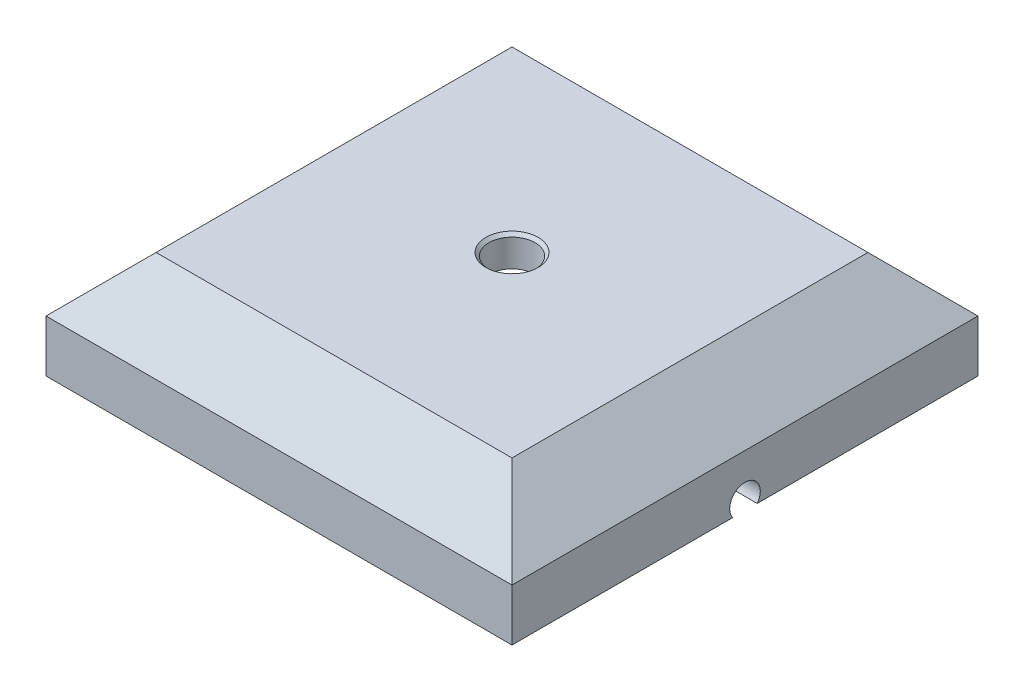
ISO-10303-21;
HEADER;
FILE_DESCRIPTION(('STEP AP214'),'2;1');
FILE_NAME('part.step','',(''),(''),'','','');
FILE_SCHEMA(('AUTOMOTIVE_DESIGN { 1 0 10303 214 1 1 1 1 }'));
ENDSEC;
DATA;
#1=APPLICATION_CONTEXT('core data for automotive mechanical design processes');
#2=APPLICATION_PROTOCOL_DEFINITION('international standard','automotive_design',2000,#1);
#3=PRODUCT_CONTEXT('',#1,'mechanical');
#4=PRODUCT('Part','Part','',(#3));
#5=PRODUCT_RELATED_PRODUCT_CATEGORY('part','',(#4));
#6=PRODUCT_DEFINITION_FORMATION('','',#4);
#7=PRODUCT_DEFINITION_CONTEXT('part definition',#1,'design');
#8=PRODUCT_DEFINITION('design','',#6,#7);
#9=PRODUCT_DEFINITION_SHAPE('','',#8);
#10=(LENGTH_UNIT() NAMED_UNIT(*) SI_UNIT(.MILLI.,.METRE.));
#11=(NAMED_UNIT(*) PLANE_ANGLE_UNIT() SI_UNIT($,.RADIAN.));
#12=(NAMED_UNIT(*) SI_UNIT($,.STERADIAN.) SOLID_ANGLE_UNIT());
#13=UNCERTAINTY_MEASURE_WITH_UNIT(LENGTH_MEASURE(1.E-05),#10,'distance_accuracy_value','');
#14=(GEOMETRIC_REPRESENTATION_CONTEXT(3) GLOBAL_UNCERTAINTY_ASSIGNED_CONTEXT((#13)) GLOBAL_UNIT_ASSIGNED_CONTEXT((#10,
#11,#12)) REPRESENTATION_CONTEXT('',''));
#15=CARTESIAN_POINT('',(0.,0.,0.));
#16=DIRECTION('',(0.,0.,1.));
#17=DIRECTION('',(1.,0.,0.));
#18=AXIS2_PLACEMENT_3D('',#15,#16,#17);
#19=CARTESIAN_POINT('',(0.,0.,0.));
#20=DIRECTION('',(0.,1.,0.));
#21=DIRECTION('',(0.,0.,1.));
#22=AXIS2_PLACEMENT_3D('',#19,#20,#21);
#23=PLANE('',#22);
#24=DIRECTION('',(0.,0.,1.));
#25=VECTOR('',#24,1.);
#26=CARTESIAN_POINT('',(63.5,0.,-63.5));
#27=LINE('',#26,#25);
#28=CARTESIAN_POINT('',(63.5,0.,-63.5));
#29=VERTEX_POINT('',#28);
#30=CARTESIAN_POINT('',(63.5,0.,-4.));
#31=VERTEX_POINT('',#30);
#32=EDGE_CURVE('E60',#29,#31,#27,.T.);
#33=ORIENTED_EDGE('',*,*,#32,.F.);
#34=DIRECTION('',(1.,0.,0.));
#35=VECTOR('',#34,1.);
#36=CARTESIAN_POINT('',(63.5,0.,-63.5));
#37=LINE('',#36,#35);
#38=CARTESIAN_POINT('',(-63.5,0.,-63.5));
#39=VERTEX_POINT('',#38);
#40=EDGE_CURVE('E164',#39,#29,#37,.T.);
#41=ORIENTED_EDGE('',*,*,#40,.F.);
#42=DIRECTION('',(0.,0.,-1.));
#43=VECTOR('',#42,1.);
#44=CARTESIAN_POINT('',(-63.5,0.,-63.5));
#45=LINE('',#44,#43);
#46=CARTESIAN_POINT('',(-63.5,0.,63.5));
#47=VERTEX_POINT('',#46);
#48=EDGE_CURVE('E140',#47,#39,#45,.T.);
#49=ORIENTED_EDGE('',*,*,#48,.F.);
#50=DIRECTION('',(-1.,0.,0.));
#51=VECTOR('',#50,1.);
#52=CARTESIAN_POINT('',(63.5,0.,63.5));
#53=LINE('',#52,#51);
#54=CARTESIAN_POINT('',(63.5,0.,63.5));
#55=VERTEX_POINT('',#54);
#56=EDGE_CURVE('E160',#55,#47,#53,.T.);
#57=ORIENTED_EDGE('',*,*,#56,.F.);
#58=CARTESIAN_POINT('',(63.5,0.,4.));
#59=VERTEX_POINT('',#58);
#60=EDGE_CURVE('E170',#59,#55,#27,.T.);
#61=ORIENTED_EDGE('',*,*,#60,.F.);
#62=DIRECTION('',(1.,0.,0.));
#63=VECTOR('',#62,1.);
#64=CARTESIAN_POINT('',(-76.201,0.,4.));
#65=LINE('',#64,#63);
#66=CARTESIAN_POINT('',(76.2,0.,4.00000000000003));
#67=VERTEX_POINT('',#66);
#68=EDGE_CURVE('E177',#67,#59,#65,.F.);
#69=ORIENTED_EDGE('',*,*,#68,.F.);
#70=DIRECTION('',(0.,0.,-1.));
#71=VECTOR('',#70,1.);
#72=CARTESIAN_POINT('',(76.2,0.,76.2));
#73=LINE('',#72,#71);
#74=CARTESIAN_POINT('',(76.2,0.,76.2));
#75=VERTEX_POINT('',#74);
#76=EDGE_CURVE('E194',#75,#67,#73,.T.);
#77=ORIENTED_EDGE('',*,*,#76,.F.);
#78=DIRECTION('',(1.,0.,0.));
#79=VECTOR('',#78,1.);
#80=CARTESIAN_POINT('',(76.2,0.,76.2));
#81=LINE('',#80,#79);
#82=CARTESIAN_POINT('',(-76.2,0.,76.2));
#83=VERTEX_POINT('',#82);
#84=EDGE_CURVE('E190',#83,#75,#81,.T.);
#85=ORIENTED_EDGE('',*,*,#84,.F.);
#86=DIRECTION('',(0.,0.,1.));
#87=VECTOR('',#86,1.);
#88=CARTESIAN_POINT('',(-76.2,0.,76.2));
#89=LINE('',#88,#87);
#90=CARTESIAN_POINT('',(-76.2,0.,-76.2));
#91=VERTEX_POINT('',#90);
#92=EDGE_CURVE('E184',#91,#83,#89,.T.);
#93=ORIENTED_EDGE('',*,*,#92,.F.);
#94=DIRECTION('',(-1.,0.,0.));
#95=VECTOR('',#94,1.);
#96=CARTESIAN_POINT('',(76.2,0.,-76.2));
#97=LINE('',#96,#95);
#98=CARTESIAN_POINT('',(76.2,0.,-76.2));
#99=VERTEX_POINT('',#98);
#100=EDGE_CURVE('E191',#99,#91,#97,.T.);
#101=ORIENTED_EDGE('',*,*,#100,.F.);
#102=CARTESIAN_POINT('',(76.2,0.,-4.));
#103=VERTEX_POINT('',#102);
#104=EDGE_CURVE('E193',#103,#99,#73,.T.);
#105=ORIENTED_EDGE('',*,*,#104,.F.);
#106=DIRECTION('',(1.,0.,0.));
#107=VECTOR('',#106,1.);
#108=CARTESIAN_POINT('',(-76.201,0.,-4.));
#109=LINE('',#108,#107);
#110=EDGE_CURVE('E178',#31,#103,#109,.T.);
#111=ORIENTED_EDGE('',*,*,#110,.F.);
#112=EDGE_LOOP('',(#33,#41,#49,#57,#61,#69,#77,#85,#93,#101,#105,#111));
#113=FACE_BOUND('',#112,.T.);
#114=ADVANCED_FACE('F41',(#113),#23,.F.);
#115=CARTESIAN_POINT('',(0.,0.,0.));
#116=DIRECTION('',(0.,1.,0.));
#117=DIRECTION('',(0.,0.,1.));
#118=AXIS2_PLACEMENT_3D('',#115,#116,#117);
#119=CYLINDRICAL_SURFACE('',#118,7.55);
#120=CARTESIAN_POINT('',(0.,34.,0.));
#121=DIRECTION('',(0.,1.,0.));
#122=DIRECTION('',(0.,0.,1.));
#123=AXIS2_PLACEMENT_3D('',#120,#121,#122);
#124=CIRCLE('',#123,7.55);
#125=CARTESIAN_POINT('',(0.,34.,7.55));
#126=VERTEX_POINT('',#125);
#127=EDGE_CURVE('E49',#126,#126,#124,.T.);
#128=ORIENTED_EDGE('',*,*,#127,.T.);
#129=EDGE_LOOP('',(#128));
#130=FACE_BOUND('',#129,.T.);
#131=CARTESIAN_POINT('',(0.,25.,0.));
#132=DIRECTION('',(0.,-1.,0.));
#133=DIRECTION('',(0.,0.,-1.));
#134=AXIS2_PLACEMENT_3D('',#131,#132,#133);
#135=CIRCLE('',#134,7.55);
#136=CARTESIAN_POINT('',(0.,25.,-7.55));
#137=VERTEX_POINT('',#136);
#138=EDGE_CURVE('E172',#137,#137,#135,.F.);
#139=ORIENTED_EDGE('',*,*,#138,.F.);
#140=EDGE_LOOP('',(#139));
#141=FACE_BOUND('',#140,.T.);
#142=ADVANCED_FACE('F236',(#130,#141),#119,.F.);
#143=CARTESIAN_POINT('',(-76.2,35.,76.2));
#144=DIRECTION('',(1.,0.,0.));
#145=DIRECTION('',(0.,0.,-1.));
#146=AXIS2_PLACEMENT_3D('',#143,#144,#145);
#147=PLANE('',#146);
#148=DIRECTION('',(0.,-1.,0.));
#149=VECTOR('',#148,1.);
#150=CARTESIAN_POINT('',(-76.2,35.,76.2));
#151=LINE('',#150,#149);
#152=CARTESIAN_POINT('',(-76.2,16.9999999999999,76.2));
#153=VERTEX_POINT('',#152);
#154=EDGE_CURVE('E202',#153,#83,#151,.T.);
#155=ORIENTED_EDGE('',*,*,#154,.F.);
#156=DIRECTION('',(0.,0.,-1.));
#157=VECTOR('',#156,1.);
#158=CARTESIAN_POINT('',(-76.2,16.9999999999999,-76.2));
#159=LINE('',#158,#157);
#160=CARTESIAN_POINT('',(-76.2,16.9999999999999,-76.2));
#161=VERTEX_POINT('',#160);
#162=EDGE_CURVE('E216',#153,#161,#159,.T.);
#163=ORIENTED_EDGE('',*,*,#162,.T.);
#164=DIRECTION('',(0.,-1.,0.));
#165=VECTOR('',#164,1.);
#166=CARTESIAN_POINT('',(-76.2,35.,-76.2));
#167=LINE('',#166,#165);
#168=EDGE_CURVE('E196',#161,#91,#167,.T.);
#169=ORIENTED_EDGE('',*,*,#168,.T.);
#170=ORIENTED_EDGE('',*,*,#92,.T.);
#171=EDGE_LOOP('',(#155,#163,#169,#170));
#172=FACE_BOUND('',#171,.T.);
#173=ADVANCED_FACE('F256',(#172),#147,.F.);
#174=CARTESIAN_POINT('',(76.2,35.,76.2));
#175=DIRECTION('',(0.,0.,-1.));
#176=DIRECTION('',(-1.,0.,0.));
#177=AXIS2_PLACEMENT_3D('',#174,#175,#176);
#178=PLANE('',#177);
#179=DIRECTION('',(0.,-1.,0.));
#180=VECTOR('',#179,1.);
#181=CARTESIAN_POINT('',(76.2,35.,76.2));
#182=LINE('',#181,#180);
#183=CARTESIAN_POINT('',(76.2,16.9999999999999,76.2));
#184=VERTEX_POINT('',#183);
#185=EDGE_CURVE('E201',#184,#75,#182,.T.);
#186=ORIENTED_EDGE('',*,*,#185,.F.);
#187=DIRECTION('',(-1.,0.,0.));
#188=VECTOR('',#187,1.);
#189=CARTESIAN_POINT('',(-76.2,16.9999999999999,76.2));
#190=LINE('',#189,#188);
#191=EDGE_CURVE('E225',#184,#153,#190,.T.);
#192=ORIENTED_EDGE('',*,*,#191,.T.);
#193=ORIENTED_EDGE('',*,*,#154,.T.);
#194=ORIENTED_EDGE('',*,*,#84,.T.);
#195=EDGE_LOOP('',(#186,#192,#193,#194));
#196=FACE_BOUND('',#195,.T.);
#197=ADVANCED_FACE('F267',(#196),#178,.F.);
#198=CARTESIAN_POINT('',(76.2,35.,76.2));
#199=DIRECTION('',(-1.,0.,0.));
#200=DIRECTION('',(0.,0.,1.));
#201=AXIS2_PLACEMENT_3D('',#198,#199,#200);
#202=PLANE('',#201);
#203=ORIENTED_EDGE('',*,*,#76,.T.);
#204=CARTESIAN_POINT('',(76.2,3.,0.));
#205=DIRECTION('',(1.,0.,0.));
#206=DIRECTION('',(0.,0.,-1.));
#207=AXIS2_PLACEMENT_3D('',#204,#205,#206);
#208=CIRCLE('',#207,5.);
#209=EDGE_CURVE('E182',#103,#67,#208,.T.);
#210=ORIENTED_EDGE('',*,*,#209,.F.);
#211=ORIENTED_EDGE('',*,*,#104,.T.);
#212=DIRECTION('',(0.,-1.,0.));
#213=VECTOR('',#212,1.);
#214=CARTESIAN_POINT('',(76.2,35.,-76.2));
#215=LINE('',#214,#213);
#216=CARTESIAN_POINT('',(76.2,16.9999999999999,-76.2));
#217=VERTEX_POINT('',#216);
#218=EDGE_CURVE('E199',#217,#99,#215,.T.);
#219=ORIENTED_EDGE('',*,*,#218,.F.);
#220=DIRECTION('',(0.,0.,1.));
#221=VECTOR('',#220,1.);
#222=CARTESIAN_POINT('',(76.2,16.9999999999999,76.2));
#223=LINE('',#222,#221);
#224=EDGE_CURVE('E61',#217,#184,#223,.T.);
#225=ORIENTED_EDGE('',*,*,#224,.T.);
#226=ORIENTED_EDGE('',*,*,#185,.T.);
#227=EDGE_LOOP('',(#203,#210,#211,#219,#225,#226));
#228=FACE_BOUND('',#227,.T.);
#229=ADVANCED_FACE('F266',(#228),#202,.F.);
#230=CARTESIAN_POINT('',(76.2,35.,-76.2));
#231=DIRECTION('',(0.,0.,1.));
#232=DIRECTION('',(1.,0.,0.));
#233=AXIS2_PLACEMENT_3D('',#230,#231,#232);
#234=PLANE('',#233);
#235=ORIENTED_EDGE('',*,*,#168,.F.);
#236=DIRECTION('',(1.,0.,0.));
#237=VECTOR('',#236,1.);
#238=CARTESIAN_POINT('',(76.2,16.9999999999999,-76.2));
#239=LINE('',#238,#237);
#240=EDGE_CURVE('E218',#161,#217,#239,.T.);
#241=ORIENTED_EDGE('',*,*,#240,.T.);
#242=ORIENTED_EDGE('',*,*,#218,.T.);
#243=ORIENTED_EDGE('',*,*,#100,.T.);
#244=EDGE_LOOP('',(#235,#241,#242,#243));
#245=FACE_BOUND('',#244,.T.);
#246=ADVANCED_FACE('F263',(#245),#234,.F.);
#247=CARTESIAN_POINT('',(0.,35.,0.));
#248=DIRECTION('',(0.,1.,0.));
#249=DIRECTION('',(0.,0.,1.));
#250=AXIS2_PLACEMENT_3D('',#247,#248,#249);
#251=PLANE('',#250);
#252=CARTESIAN_POINT('',(0.,35.,0.));
#253=DIRECTION('',(0.,1.,0.));
#254=DIRECTION('',(0.,0.,1.));
#255=AXIS2_PLACEMENT_3D('',#252,#253,#254);
#256=CIRCLE('',#255,8.55000000000003);
#257=CARTESIAN_POINT('',(0.,35.,8.55000000000003));
#258=VERTEX_POINT('',#257);
#259=EDGE_CURVE('E11',#258,#258,#256,.F.);
#260=ORIENTED_EDGE('',*,*,#259,.T.);
#261=EDGE_LOOP('',(#260));
#262=FACE_BOUND('',#261,.T.);
#263=DIRECTION('',(-1.,0.,0.));
#264=VECTOR('',#263,1.);
#265=CARTESIAN_POINT('',(-76.2,35.,-58.2));
#266=LINE('',#265,#264);
#267=CARTESIAN_POINT('',(58.2,35.,-58.2));
#268=VERTEX_POINT('',#267);
#269=CARTESIAN_POINT('',(-58.2,35.,-58.2));
#270=VERTEX_POINT('',#269);
#271=EDGE_CURVE('E211',#268,#270,#266,.T.);
#272=ORIENTED_EDGE('',*,*,#271,.T.);
#273=DIRECTION('',(0.,0.,1.));
#274=VECTOR('',#273,1.);
#275=CARTESIAN_POINT('',(-58.2,35.,76.2));
#276=LINE('',#275,#274);
#277=CARTESIAN_POINT('',(-58.2,35.,58.2));
#278=VERTEX_POINT('',#277);
#279=EDGE_CURVE('E213',#270,#278,#276,.T.);
#280=ORIENTED_EDGE('',*,*,#279,.T.);
#281=DIRECTION('',(1.,0.,0.));
#282=VECTOR('',#281,1.);
#283=CARTESIAN_POINT('',(76.2,35.,58.2));
#284=LINE('',#283,#282);
#285=CARTESIAN_POINT('',(58.2,35.,58.2));
#286=VERTEX_POINT('',#285);
#287=EDGE_CURVE('E210',#278,#286,#284,.T.);
#288=ORIENTED_EDGE('',*,*,#287,.T.);
#289=DIRECTION('',(0.,0.,-1.));
#290=VECTOR('',#289,1.);
#291=CARTESIAN_POINT('',(58.2,35.,-76.2));
#292=LINE('',#291,#290);
#293=EDGE_CURVE('E207',#286,#268,#292,.T.);
#294=ORIENTED_EDGE('',*,*,#293,.T.);
#295=EDGE_LOOP('',(#272,#280,#288,#294));
#296=FACE_BOUND('',#295,.T.);
#297=ADVANCED_FACE('F265',(#262,#296),#251,.T.);
#298=CARTESIAN_POINT('',(58.2,35.,0.));
#299=DIRECTION('',(0.707106781186549,0.707106781186546,0.));
#300=DIRECTION('',(0.,0.,1.));
#301=AXIS2_PLACEMENT_3D('',#298,#299,#300);
#302=PLANE('',#301);
#303=DIRECTION('',(-0.577350269189625,0.577350269189627,-0.577350269189625));
#304=VECTOR('',#303,1.);
#305=CARTESIAN_POINT('',(38.8000000000001,54.4,38.8));
#306=LINE('',#305,#304);
#307=EDGE_CURVE('E228',#184,#286,#306,.T.);
#308=ORIENTED_EDGE('',*,*,#307,.F.);
#309=ORIENTED_EDGE('',*,*,#224,.F.);
#310=DIRECTION('',(-0.577350269189625,0.577350269189627,0.577350269189625));
#311=VECTOR('',#310,1.);
#312=CARTESIAN_POINT('',(38.8000000000001,54.4,-38.8));
#313=LINE('',#312,#311);
#314=EDGE_CURVE('E188',#268,#217,#313,.F.);
#315=ORIENTED_EDGE('',*,*,#314,.F.);
#316=ORIENTED_EDGE('',*,*,#293,.F.);
#317=EDGE_LOOP('',(#308,#309,#315,#316));
#318=FACE_BOUND('',#317,.T.);
#319=ADVANCED_FACE('F300',(#318),#302,.T.);
#320=CARTESIAN_POINT('',(0.,35.,-58.2));
#321=DIRECTION('',(0.,0.707106781186546,-0.707106781186549));
#322=DIRECTION('',(1.,0.,0.));
#323=AXIS2_PLACEMENT_3D('',#320,#321,#322);
#324=PLANE('',#323);
#325=ORIENTED_EDGE('',*,*,#314,.T.);
#326=ORIENTED_EDGE('',*,*,#240,.F.);
#327=DIRECTION('',(0.577350269189625,0.577350269189627,0.577350269189625));
#328=VECTOR('',#327,1.);
#329=CARTESIAN_POINT('',(-38.8,54.4,-38.8));
#330=LINE('',#329,#328);
#331=EDGE_CURVE('E227',#270,#161,#330,.F.);
#332=ORIENTED_EDGE('',*,*,#331,.F.);
#333=ORIENTED_EDGE('',*,*,#271,.F.);
#334=EDGE_LOOP('',(#325,#326,#332,#333));
#335=FACE_BOUND('',#334,.T.);
#336=ADVANCED_FACE('F292',(#335),#324,.T.);
#337=CARTESIAN_POINT('',(0.,35.,58.2));
#338=DIRECTION('',(0.,0.707106781186546,0.707106781186549));
#339=DIRECTION('',(-1.,0.,0.));
#340=AXIS2_PLACEMENT_3D('',#337,#338,#339);
#341=PLANE('',#340);
#342=ORIENTED_EDGE('',*,*,#307,.T.);
#343=ORIENTED_EDGE('',*,*,#287,.F.);
#344=DIRECTION('',(-0.577350269189625,-0.577350269189627,0.577350269189625));
#345=VECTOR('',#344,1.);
#346=CARTESIAN_POINT('',(-38.8,54.4,38.8));
#347=LINE('',#346,#345);
#348=EDGE_CURVE('E181',#153,#278,#347,.F.);
#349=ORIENTED_EDGE('',*,*,#348,.F.);
#350=ORIENTED_EDGE('',*,*,#191,.F.);
#351=EDGE_LOOP('',(#342,#343,#349,#350));
#352=FACE_BOUND('',#351,.T.);
#353=ADVANCED_FACE('F284',(#352),#341,.T.);
#354=CARTESIAN_POINT('',(-58.2,35.,0.));
#355=DIRECTION('',(-0.707106781186549,0.707106781186546,0.));
#356=DIRECTION('',(0.,0.,-1.));
#357=AXIS2_PLACEMENT_3D('',#354,#355,#356);
#358=PLANE('',#357);
#359=ORIENTED_EDGE('',*,*,#331,.T.);
#360=ORIENTED_EDGE('',*,*,#162,.F.);
#361=ORIENTED_EDGE('',*,*,#348,.T.);
#362=ORIENTED_EDGE('',*,*,#279,.F.);
#363=EDGE_LOOP('',(#359,#360,#361,#362));
#364=FACE_BOUND('',#363,.T.);
#365=ADVANCED_FACE('F280',(#364),#358,.T.);
#366=CARTESIAN_POINT('',(-76.201,3.,0.));
#367=DIRECTION('',(1.,0.,0.));
#368=DIRECTION('',(0.,0.,-1.));
#369=AXIS2_PLACEMENT_3D('',#366,#367,#368);
#370=CYLINDRICAL_SURFACE('',#369,5.);
#371=ORIENTED_EDGE('',*,*,#68,.T.);
#372=CARTESIAN_POINT('',(63.5,3.,0.));
#373=DIRECTION('',(1.,0.,0.));
#374=DIRECTION('',(0.,0.,-1.));
#375=AXIS2_PLACEMENT_3D('',#372,#373,#374);
#376=CIRCLE('',#375,5.);
#377=EDGE_CURVE('E221',#59,#31,#376,.F.);
#378=ORIENTED_EDGE('',*,*,#377,.T.);
#379=ORIENTED_EDGE('',*,*,#110,.T.);
#380=ORIENTED_EDGE('',*,*,#209,.T.);
#381=EDGE_LOOP('',(#371,#378,#379,#380));
#382=FACE_BOUND('',#381,.T.);
#383=ADVANCED_FACE('F283',(#382),#370,.F.);
#384=CARTESIAN_POINT('',(0.,25.,0.));
#385=DIRECTION('',(0.,-1.,0.));
#386=DIRECTION('',(0.,0.,-1.));
#387=AXIS2_PLACEMENT_3D('',#384,#385,#386);
#388=PLANE('',#387);
#389=DIRECTION('',(0.,0.,-1.));
#390=VECTOR('',#389,1.);
#391=CARTESIAN_POINT('',(-63.5,25.,-63.5));
#392=LINE('',#391,#390);
#393=CARTESIAN_POINT('',(-63.5,25.,63.5));
#394=VERTEX_POINT('',#393);
#395=CARTESIAN_POINT('',(-63.5,25.,-63.5));
#396=VERTEX_POINT('',#395);
#397=EDGE_CURVE('E138',#394,#396,#392,.T.);
#398=ORIENTED_EDGE('',*,*,#397,.T.);
#399=DIRECTION('',(1.,0.,0.));
#400=VECTOR('',#399,1.);
#401=CARTESIAN_POINT('',(63.5,25.,-63.5));
#402=LINE('',#401,#400);
#403=CARTESIAN_POINT('',(63.5,25.,-63.5));
#404=VERTEX_POINT('',#403);
#405=EDGE_CURVE('E150',#396,#404,#402,.T.);
#406=ORIENTED_EDGE('',*,*,#405,.T.);
#407=DIRECTION('',(0.,0.,1.));
#408=VECTOR('',#407,1.);
#409=CARTESIAN_POINT('',(63.5,25.,-63.5));
#410=LINE('',#409,#408);
#411=CARTESIAN_POINT('',(63.5,25.,63.5));
#412=VERTEX_POINT('',#411);
#413=EDGE_CURVE('E155',#404,#412,#410,.T.);
#414=ORIENTED_EDGE('',*,*,#413,.T.);
#415=DIRECTION('',(-1.,0.,0.));
#416=VECTOR('',#415,1.);
#417=CARTESIAN_POINT('',(63.5,25.,63.5));
#418=LINE('',#417,#416);
#419=EDGE_CURVE('E145',#412,#394,#418,.T.);
#420=ORIENTED_EDGE('',*,*,#419,.T.);
#421=EDGE_LOOP('',(#398,#406,#414,#420));
#422=FACE_BOUND('',#421,.T.);
#423=ORIENTED_EDGE('',*,*,#138,.T.);
#424=EDGE_LOOP('',(#423));
#425=FACE_BOUND('',#424,.T.);
#426=ADVANCED_FACE('F152',(#422,#425),#388,.T.);
#427=CARTESIAN_POINT('',(63.5,25.,-63.5));
#428=DIRECTION('',(1.,0.,0.));
#429=DIRECTION('',(0.,0.,-1.));
#430=AXIS2_PLACEMENT_3D('',#427,#428,#429);
#431=PLANE('',#430);
#432=ORIENTED_EDGE('',*,*,#60,.T.);
#433=DIRECTION('',(0.,-1.,0.));
#434=VECTOR('',#433,1.);
#435=CARTESIAN_POINT('',(63.5,25.,63.5));
#436=LINE('',#435,#434);
#437=EDGE_CURVE('E175',#412,#55,#436,.T.);
#438=ORIENTED_EDGE('',*,*,#437,.F.);
#439=ORIENTED_EDGE('',*,*,#413,.F.);
#440=DIRECTION('',(0.,-1.,0.));
#441=VECTOR('',#440,1.);
#442=CARTESIAN_POINT('',(63.5,25.,-63.5));
#443=LINE('',#442,#441);
#444=EDGE_CURVE('E141',#404,#29,#443,.T.);
#445=ORIENTED_EDGE('',*,*,#444,.T.);
#446=ORIENTED_EDGE('',*,*,#32,.T.);
#447=ORIENTED_EDGE('',*,*,#377,.F.);
#448=EDGE_LOOP('',(#432,#438,#439,#445,#446,#447));
#449=FACE_BOUND('',#448,.T.);
#450=ADVANCED_FACE('F329',(#449),#431,.F.);
#451=CARTESIAN_POINT('',(-63.5,25.,-63.5));
#452=DIRECTION('',(-1.,0.,0.));
#453=DIRECTION('',(0.,0.,1.));
#454=AXIS2_PLACEMENT_3D('',#451,#452,#453);
#455=PLANE('',#454);
#456=ORIENTED_EDGE('',*,*,#48,.T.);
#457=DIRECTION('',(0.,-1.,0.));
#458=VECTOR('',#457,1.);
#459=CARTESIAN_POINT('',(-63.5,25.,-63.5));
#460=LINE('',#459,#458);
#461=EDGE_CURVE('E135',#396,#39,#460,.T.);
#462=ORIENTED_EDGE('',*,*,#461,.F.);
#463=ORIENTED_EDGE('',*,*,#397,.F.);
#464=DIRECTION('',(0.,-1.,0.));
#465=VECTOR('',#464,1.);
#466=CARTESIAN_POINT('',(-63.5,25.,63.5));
#467=LINE('',#466,#465);
#468=EDGE_CURVE('E166',#394,#47,#467,.T.);
#469=ORIENTED_EDGE('',*,*,#468,.T.);
#470=EDGE_LOOP('',(#456,#462,#463,#469));
#471=FACE_BOUND('',#470,.T.);
#472=ADVANCED_FACE('F134',(#471),#455,.F.);
#473=CARTESIAN_POINT('',(63.5,25.,63.5));
#474=DIRECTION('',(0.,0.,1.));
#475=DIRECTION('',(1.,0.,0.));
#476=AXIS2_PLACEMENT_3D('',#473,#474,#475);
#477=PLANE('',#476);
#478=ORIENTED_EDGE('',*,*,#56,.T.);
#479=ORIENTED_EDGE('',*,*,#468,.F.);
#480=ORIENTED_EDGE('',*,*,#419,.F.);
#481=ORIENTED_EDGE('',*,*,#437,.T.);
#482=EDGE_LOOP('',(#478,#479,#480,#481));
#483=FACE_BOUND('',#482,.T.);
#484=ADVANCED_FACE('F249',(#483),#477,.F.);
#485=CARTESIAN_POINT('',(63.5,25.,-63.5));
#486=DIRECTION('',(0.,0.,-1.));
#487=DIRECTION('',(-1.,0.,0.));
#488=AXIS2_PLACEMENT_3D('',#485,#486,#487);
#489=PLANE('',#488);
#490=ORIENTED_EDGE('',*,*,#40,.T.);
#491=ORIENTED_EDGE('',*,*,#444,.F.);
#492=ORIENTED_EDGE('',*,*,#405,.F.);
#493=ORIENTED_EDGE('',*,*,#461,.T.);
#494=EDGE_LOOP('',(#490,#491,#492,#493));
#495=FACE_BOUND('',#494,.T.);
#496=ADVANCED_FACE('F146',(#495),#489,.F.);
#497=CARTESIAN_POINT('',(0.,34.,0.));
#498=DIRECTION('',(0.,1.,0.));
#499=DIRECTION('',(0.,0.,1.));
#500=AXIS2_PLACEMENT_3D('',#497,#498,#499);
#501=CONICAL_SURFACE('',#500,7.55,0.785398163397463);
#502=ORIENTED_EDGE('',*,*,#259,.F.);
#503=EDGE_LOOP('',(#502));
#504=FACE_BOUND('',#503,.T.);
#505=ORIENTED_EDGE('',*,*,#127,.F.);
#506=EDGE_LOOP('',(#505));
#507=FACE_BOUND('',#506,.T.);
#508=ADVANCED_FACE('F42',(#504,#507),#501,.F.);
#509=CLOSED_SHELL('',(#114,#142,#173,#197,#229,#246,#297,#319,#336,#353,#365,#383,#426,#450,
#472,#484,#496,#508));
#510=MANIFOLD_SOLID_BREP('B2',#509);
#511=ADVANCED_BREP_SHAPE_REPRESENTATION('',(#18,#510),#14);
#512=SHAPE_DEFINITION_REPRESENTATION(#9,#511);
ENDSEC;
END-ISO-10303-21;
